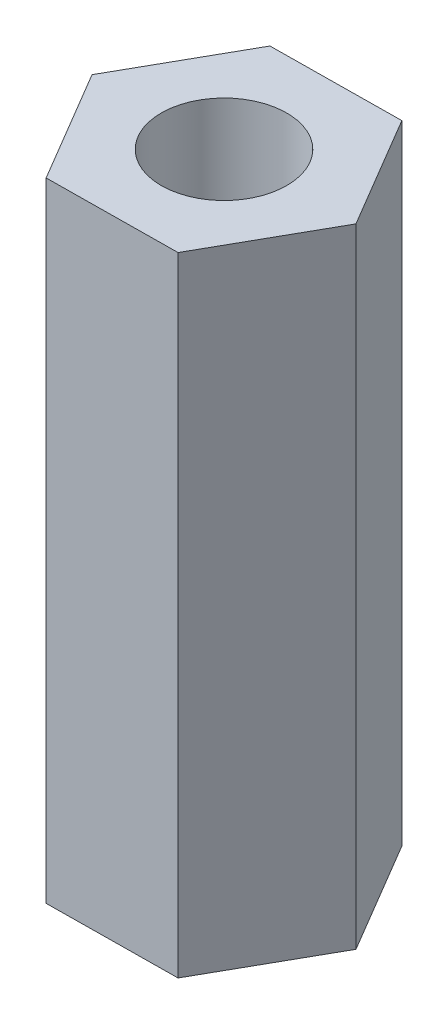
ISO-10303-21;
HEADER;
FILE_DESCRIPTION(('STEP AP214'),'2;1');
FILE_NAME('part.step','',(''),(''),'','','');
FILE_SCHEMA(('AUTOMOTIVE_DESIGN { 1 0 10303 214 1 1 1 1 }'));
ENDSEC;
DATA;
#1=APPLICATION_CONTEXT('core data for automotive mechanical design processes');
#2=APPLICATION_PROTOCOL_DEFINITION('international standard','automotive_design',2000,#1);
#3=PRODUCT_CONTEXT('',#1,'mechanical');
#4=PRODUCT('Part','Part','',(#3));
#5=PRODUCT_RELATED_PRODUCT_CATEGORY('part','',(#4));
#6=PRODUCT_DEFINITION_FORMATION('','',#4);
#7=PRODUCT_DEFINITION_CONTEXT('part definition',#1,'design');
#8=PRODUCT_DEFINITION('design','',#6,#7);
#9=PRODUCT_DEFINITION_SHAPE('','',#8);
#10=(LENGTH_UNIT() NAMED_UNIT(*) SI_UNIT(.MILLI.,.METRE.));
#11=(NAMED_UNIT(*) PLANE_ANGLE_UNIT() SI_UNIT($,.RADIAN.));
#12=(NAMED_UNIT(*) SI_UNIT($,.STERADIAN.) SOLID_ANGLE_UNIT());
#13=UNCERTAINTY_MEASURE_WITH_UNIT(LENGTH_MEASURE(1.E-05),#10,'distance_accuracy_value','');
#14=(GEOMETRIC_REPRESENTATION_CONTEXT(3) GLOBAL_UNCERTAINTY_ASSIGNED_CONTEXT((#13)) GLOBAL_UNIT_ASSIGNED_CONTEXT((#10,
#11,#12)) REPRESENTATION_CONTEXT('',''));
#15=CARTESIAN_POINT('',(0.,0.,0.));
#16=DIRECTION('',(0.,0.,1.));
#17=DIRECTION('',(1.,0.,0.));
#18=AXIS2_PLACEMENT_3D('',#15,#16,#17);
#19=CARTESIAN_POINT('',(0.,15.,0.));
#20=DIRECTION('',(0.,1.,0.));
#21=DIRECTION('',(0.,0.,1.));
#22=AXIS2_PLACEMENT_3D('',#19,#20,#21);
#23=PLANE('',#22);
#24=DIRECTION('',(-0.508981465607884,0.,-0.860777478601555));
#25=VECTOR('',#24,1.);
#26=CARTESIAN_POINT('',(3.11752277491355,15.,-0.0324306628872545));
#27=LINE('',#26,#25);
#28=CARTESIAN_POINT('',(3.11752277491355,15.,-0.0324306628872545));
#29=VERTEX_POINT('',#28);
#30=CARTESIAN_POINT('',(1.53067560953484,15.,-2.71606925139532));
#31=VERTEX_POINT('',#30);
#32=EDGE_CURVE('E128',#29,#31,#27,.T.);
#33=ORIENTED_EDGE('',*,*,#32,.T.);
#34=DIRECTION('',(-0.999945896278405,0.,0.0104021399710857));
#35=VECTOR('',#34,1.);
#36=CARTESIAN_POINT('',(1.53067560953484,15.,-2.71606925139532));
#37=LINE('',#36,#35);
#38=CARTESIAN_POINT('',(-1.58684716537871,15.,-2.68363858850807));
#39=VERTEX_POINT('',#38);
#40=EDGE_CURVE('E86',#31,#39,#37,.T.);
#41=ORIENTED_EDGE('',*,*,#40,.T.);
#42=DIRECTION('',(-0.49096443067052,0.,0.871179618572641));
#43=VECTOR('',#42,1.);
#44=CARTESIAN_POINT('',(-1.58684716537871,15.,-2.68363858850807));
#45=LINE('',#44,#43);
#46=CARTESIAN_POINT('',(-3.11752277491355,15.,0.0324306628872555));
#47=VERTEX_POINT('',#46);
#48=EDGE_CURVE('E99',#39,#47,#45,.T.);
#49=ORIENTED_EDGE('',*,*,#48,.T.);
#50=DIRECTION('',(0.508981465607884,0.,0.860777478601555));
#51=VECTOR('',#50,1.);
#52=CARTESIAN_POINT('',(-3.11752277491355,15.,0.0324306628872555));
#53=LINE('',#52,#51);
#54=CARTESIAN_POINT('',(-1.53067560953484,15.,2.71606925139532));
#55=VERTEX_POINT('',#54);
#56=EDGE_CURVE('E93',#47,#55,#53,.T.);
#57=ORIENTED_EDGE('',*,*,#56,.T.);
#58=DIRECTION('',(0.999945896278405,0.,-0.0104021399710854));
#59=VECTOR('',#58,1.);
#60=CARTESIAN_POINT('',(-1.53067560953484,15.,2.71606925139532));
#61=LINE('',#60,#59);
#62=CARTESIAN_POINT('',(1.58684716537871,15.,2.68363858850807));
#63=VERTEX_POINT('',#62);
#64=EDGE_CURVE('E97',#55,#63,#61,.T.);
#65=ORIENTED_EDGE('',*,*,#64,.T.);
#66=DIRECTION('',(0.49096443067052,0.,-0.871179618572641));
#67=VECTOR('',#66,1.);
#68=CARTESIAN_POINT('',(1.58684716537871,15.,2.68363858850807));
#69=LINE('',#68,#67);
#70=EDGE_CURVE('E49',#63,#29,#69,.T.);
#71=ORIENTED_EDGE('',*,*,#70,.T.);
#72=EDGE_LOOP('',(#33,#41,#49,#57,#65,#71));
#73=FACE_BOUND('',#72,.T.);
#74=CARTESIAN_POINT('',(0.,15.,0.));
#75=DIRECTION('',(0.,1.,0.));
#76=DIRECTION('',(0.,0.,1.));
#77=AXIS2_PLACEMENT_3D('',#74,#75,#76);
#78=CIRCLE('',#77,1.5);
#79=CARTESIAN_POINT('',(0.,15.,1.5));
#80=VERTEX_POINT('',#79);
#81=EDGE_CURVE('E121',#80,#80,#78,.T.);
#82=ORIENTED_EDGE('',*,*,#81,.F.);
#83=EDGE_LOOP('',(#82));
#84=FACE_BOUND('',#83,.T.);
#85=ADVANCED_FACE('F32',(#73,#84),#23,.T.);
#86=CARTESIAN_POINT('',(0.,0.,0.));
#87=DIRECTION('',(0.,1.,0.));
#88=DIRECTION('',(0.,0.,1.));
#89=AXIS2_PLACEMENT_3D('',#86,#87,#88);
#90=PLANE('',#89);
#91=DIRECTION('',(-0.508981465607884,0.,-0.860777478601555));
#92=VECTOR('',#91,1.);
#93=CARTESIAN_POINT('',(3.11752277491355,0.,-0.0324306628872545));
#94=LINE('',#93,#92);
#95=CARTESIAN_POINT('',(3.11752277491355,0.,-0.0324306628872545));
#96=VERTEX_POINT('',#95);
#97=CARTESIAN_POINT('',(1.53067560953484,0.,-2.71606925139532));
#98=VERTEX_POINT('',#97);
#99=EDGE_CURVE('E117',#96,#98,#94,.T.);
#100=ORIENTED_EDGE('',*,*,#99,.F.);
#101=DIRECTION('',(0.49096443067052,0.,-0.871179618572641));
#102=VECTOR('',#101,1.);
#103=CARTESIAN_POINT('',(1.58684716537871,0.,2.68363858850807));
#104=LINE('',#103,#102);
#105=CARTESIAN_POINT('',(1.58684716537871,0.,2.68363858850807));
#106=VERTEX_POINT('',#105);
#107=EDGE_CURVE('E78',#106,#96,#104,.T.);
#108=ORIENTED_EDGE('',*,*,#107,.F.);
#109=DIRECTION('',(0.999945896278405,0.,-0.0104021399710854));
#110=VECTOR('',#109,1.);
#111=CARTESIAN_POINT('',(-1.53067560953484,0.,2.71606925139532));
#112=LINE('',#111,#110);
#113=CARTESIAN_POINT('',(-1.53067560953484,0.,2.71606925139532));
#114=VERTEX_POINT('',#113);
#115=EDGE_CURVE('E72',#114,#106,#112,.T.);
#116=ORIENTED_EDGE('',*,*,#115,.F.);
#117=DIRECTION('',(0.508981465607884,0.,0.860777478601555));
#118=VECTOR('',#117,1.);
#119=CARTESIAN_POINT('',(-3.11752277491355,0.,0.0324306628872555));
#120=LINE('',#119,#118);
#121=CARTESIAN_POINT('',(-3.11752277491355,0.,0.0324306628872555));
#122=VERTEX_POINT('',#121);
#123=EDGE_CURVE('E107',#122,#114,#120,.T.);
#124=ORIENTED_EDGE('',*,*,#123,.F.);
#125=DIRECTION('',(-0.49096443067052,0.,0.871179618572641));
#126=VECTOR('',#125,1.);
#127=CARTESIAN_POINT('',(-1.58684716537871,0.,-2.68363858850807));
#128=LINE('',#127,#126);
#129=CARTESIAN_POINT('',(-1.58684716537871,0.,-2.68363858850807));
#130=VERTEX_POINT('',#129);
#131=EDGE_CURVE('E123',#130,#122,#128,.T.);
#132=ORIENTED_EDGE('',*,*,#131,.F.);
#133=DIRECTION('',(-0.999945896278405,0.,0.0104021399710857));
#134=VECTOR('',#133,1.);
#135=CARTESIAN_POINT('',(1.53067560953484,0.,-2.71606925139532));
#136=LINE('',#135,#134);
#137=EDGE_CURVE('E120',#98,#130,#136,.T.);
#138=ORIENTED_EDGE('',*,*,#137,.F.);
#139=EDGE_LOOP('',(#100,#108,#116,#124,#132,#138));
#140=FACE_BOUND('',#139,.T.);
#141=CARTESIAN_POINT('',(0.,0.,0.));
#142=DIRECTION('',(0.,1.,0.));
#143=DIRECTION('',(0.,0.,1.));
#144=AXIS2_PLACEMENT_3D('',#141,#142,#143);
#145=CIRCLE('',#144,1.5);
#146=CARTESIAN_POINT('',(0.,0.,1.5));
#147=VERTEX_POINT('',#146);
#148=EDGE_CURVE('E221',#147,#147,#145,.T.);
#149=ORIENTED_EDGE('',*,*,#148,.T.);
#150=EDGE_LOOP('',(#149));
#151=FACE_BOUND('',#150,.T.);
#152=ADVANCED_FACE('F137',(#140,#151),#90,.F.);
#153=CARTESIAN_POINT('',(3.11752277491355,15.,-0.0324306628872545));
#154=DIRECTION('',(-0.860777478601555,0.,0.508981465607884));
#155=DIRECTION('',(0.508981465607884,0.,0.860777478601555));
#156=AXIS2_PLACEMENT_3D('',#153,#154,#155);
#157=PLANE('',#156);
#158=ORIENTED_EDGE('',*,*,#99,.T.);
#159=DIRECTION('',(0.,-1.,0.));
#160=VECTOR('',#159,1.);
#161=CARTESIAN_POINT('',(1.53067560953484,15.,-2.71606925139532));
#162=LINE('',#161,#160);
#163=EDGE_CURVE('E11',#31,#98,#162,.T.);
#164=ORIENTED_EDGE('',*,*,#163,.F.);
#165=ORIENTED_EDGE('',*,*,#32,.F.);
#166=DIRECTION('',(0.,-1.,0.));
#167=VECTOR('',#166,1.);
#168=CARTESIAN_POINT('',(3.11752277491355,15.,-0.0324306628872545));
#169=LINE('',#168,#167);
#170=EDGE_CURVE('E113',#29,#96,#169,.T.);
#171=ORIENTED_EDGE('',*,*,#170,.T.);
#172=EDGE_LOOP('',(#158,#164,#165,#171));
#173=FACE_BOUND('',#172,.T.);
#174=ADVANCED_FACE('F34',(#173),#157,.F.);
#175=CARTESIAN_POINT('',(1.53067560953484,15.,-2.71606925139532));
#176=DIRECTION('',(0.0104021399710857,0.,0.999945896278405));
#177=DIRECTION('',(0.999945896278405,0.,-0.0104021399710857));
#178=AXIS2_PLACEMENT_3D('',#175,#176,#177);
#179=PLANE('',#178);
#180=ORIENTED_EDGE('',*,*,#137,.T.);
#181=DIRECTION('',(0.,-1.,0.));
#182=VECTOR('',#181,1.);
#183=CARTESIAN_POINT('',(-1.58684716537871,15.,-2.68363858850807));
#184=LINE('',#183,#182);
#185=EDGE_CURVE('E41',#39,#130,#184,.T.);
#186=ORIENTED_EDGE('',*,*,#185,.F.);
#187=ORIENTED_EDGE('',*,*,#40,.F.);
#188=ORIENTED_EDGE('',*,*,#163,.T.);
#189=EDGE_LOOP('',(#180,#186,#187,#188));
#190=FACE_BOUND('',#189,.T.);
#191=ADVANCED_FACE('F162',(#190),#179,.F.);
#192=CARTESIAN_POINT('',(-1.58684716537871,15.,-2.68363858850807));
#193=DIRECTION('',(0.871179618572641,0.,0.49096443067052));
#194=DIRECTION('',(0.49096443067052,0.,-0.871179618572641));
#195=AXIS2_PLACEMENT_3D('',#192,#193,#194);
#196=PLANE('',#195);
#197=ORIENTED_EDGE('',*,*,#131,.T.);
#198=DIRECTION('',(0.,-1.,0.));
#199=VECTOR('',#198,1.);
#200=CARTESIAN_POINT('',(-3.11752277491355,15.,0.0324306628872555));
#201=LINE('',#200,#199);
#202=EDGE_CURVE('E108',#47,#122,#201,.T.);
#203=ORIENTED_EDGE('',*,*,#202,.F.);
#204=ORIENTED_EDGE('',*,*,#48,.F.);
#205=ORIENTED_EDGE('',*,*,#185,.T.);
#206=EDGE_LOOP('',(#197,#203,#204,#205));
#207=FACE_BOUND('',#206,.T.);
#208=ADVANCED_FACE('F134',(#207),#196,.F.);
#209=CARTESIAN_POINT('',(-3.11752277491355,15.,0.0324306628872555));
#210=DIRECTION('',(0.860777478601555,0.,-0.508981465607884));
#211=DIRECTION('',(-0.508981465607884,0.,-0.860777478601555));
#212=AXIS2_PLACEMENT_3D('',#209,#210,#211);
#213=PLANE('',#212);
#214=ORIENTED_EDGE('',*,*,#123,.T.);
#215=DIRECTION('',(0.,-1.,0.));
#216=VECTOR('',#215,1.);
#217=CARTESIAN_POINT('',(-1.53067560953484,15.,2.71606925139532));
#218=LINE('',#217,#216);
#219=EDGE_CURVE('E104',#55,#114,#218,.T.);
#220=ORIENTED_EDGE('',*,*,#219,.F.);
#221=ORIENTED_EDGE('',*,*,#56,.F.);
#222=ORIENTED_EDGE('',*,*,#202,.T.);
#223=EDGE_LOOP('',(#214,#220,#221,#222));
#224=FACE_BOUND('',#223,.T.);
#225=ADVANCED_FACE('F105',(#224),#213,.F.);
#226=CARTESIAN_POINT('',(-1.53067560953484,15.,2.71606925139532));
#227=DIRECTION('',(-0.0104021399710854,0.,-0.999945896278405));
#228=DIRECTION('',(-0.999945896278405,0.,0.0104021399710854));
#229=AXIS2_PLACEMENT_3D('',#226,#227,#228);
#230=PLANE('',#229);
#231=ORIENTED_EDGE('',*,*,#115,.T.);
#232=DIRECTION('',(0.,-1.,0.));
#233=VECTOR('',#232,1.);
#234=CARTESIAN_POINT('',(1.58684716537871,15.,2.68363858850807));
#235=LINE('',#234,#233);
#236=EDGE_CURVE('E109',#63,#106,#235,.T.);
#237=ORIENTED_EDGE('',*,*,#236,.F.);
#238=ORIENTED_EDGE('',*,*,#64,.F.);
#239=ORIENTED_EDGE('',*,*,#219,.T.);
#240=EDGE_LOOP('',(#231,#237,#238,#239));
#241=FACE_BOUND('',#240,.T.);
#242=ADVANCED_FACE('F111',(#241),#230,.F.);
#243=CARTESIAN_POINT('',(1.58684716537871,15.,2.68363858850807));
#244=DIRECTION('',(-0.871179618572641,0.,-0.49096443067052));
#245=DIRECTION('',(-0.49096443067052,0.,0.871179618572641));
#246=AXIS2_PLACEMENT_3D('',#243,#244,#245);
#247=PLANE('',#246);
#248=ORIENTED_EDGE('',*,*,#107,.T.);
#249=ORIENTED_EDGE('',*,*,#170,.F.);
#250=ORIENTED_EDGE('',*,*,#70,.F.);
#251=ORIENTED_EDGE('',*,*,#236,.T.);
#252=EDGE_LOOP('',(#248,#249,#250,#251));
#253=FACE_BOUND('',#252,.T.);
#254=ADVANCED_FACE('F142',(#253),#247,.F.);
#255=CARTESIAN_POINT('',(0.,15.,0.));
#256=DIRECTION('',(0.,-1.,0.));
#257=DIRECTION('',(0.,0.,-1.));
#258=AXIS2_PLACEMENT_3D('',#255,#256,#257);
#259=CYLINDRICAL_SURFACE('',#258,1.5);
#260=ORIENTED_EDGE('',*,*,#81,.T.);
#261=EDGE_LOOP('',(#260));
#262=FACE_BOUND('',#261,.T.);
#263=ORIENTED_EDGE('',*,*,#148,.F.);
#264=EDGE_LOOP('',(#263));
#265=FACE_BOUND('',#264,.T.);
#266=ADVANCED_FACE('F144',(#262,#265),#259,.F.);
#267=CLOSED_SHELL('',(#85,#152,#174,#191,#208,#225,#242,#254,#266));
#268=MANIFOLD_SOLID_BREP('B2',#267);
#269=ADVANCED_BREP_SHAPE_REPRESENTATION('',(#18,#268),#14);
#270=SHAPE_DEFINITION_REPRESENTATION(#9,#269);
ENDSEC;
END-ISO-10303-21;
